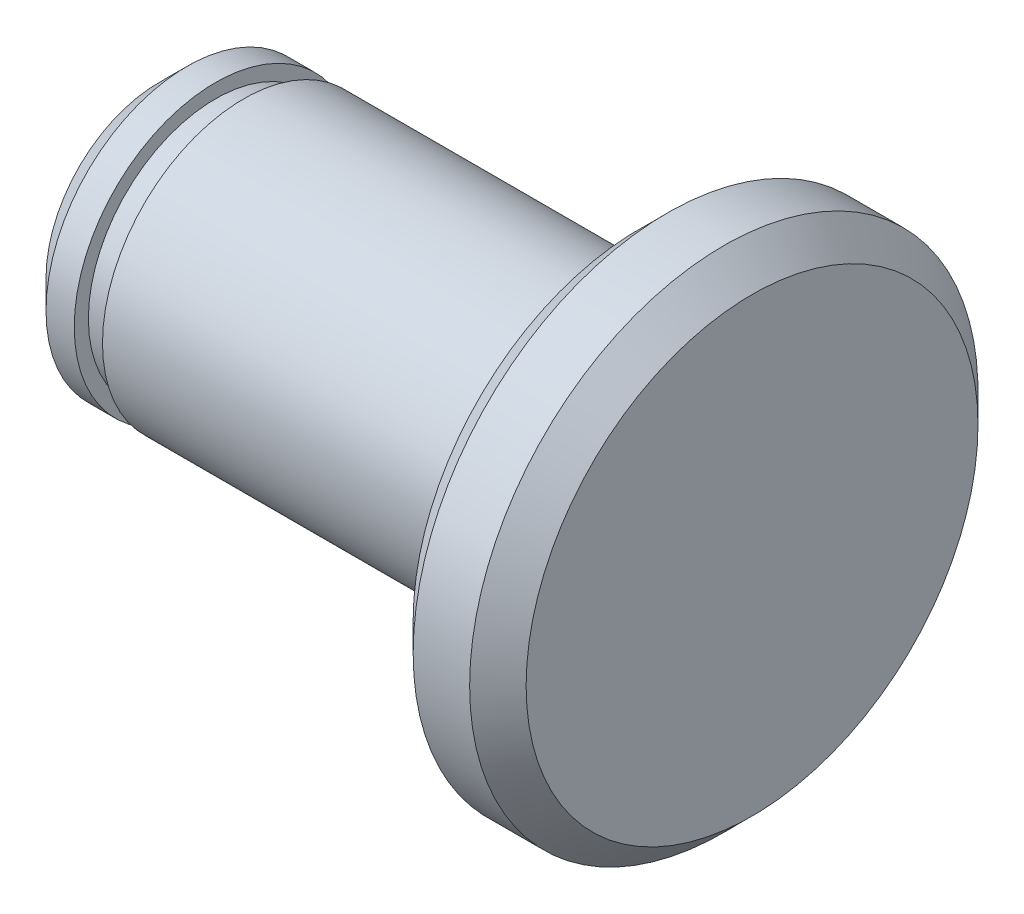
ISO-10303-21;
HEADER;
FILE_DESCRIPTION(('STEP AP214'),'2;1');
FILE_NAME('part.step','',(''),(''),'','','');
FILE_SCHEMA(('AUTOMOTIVE_DESIGN { 1 0 10303 214 1 1 1 1 }'));
ENDSEC;
DATA;
#1=APPLICATION_CONTEXT('core data for automotive mechanical design processes');
#2=APPLICATION_PROTOCOL_DEFINITION('international standard','automotive_design',2000,#1);
#3=PRODUCT_CONTEXT('',#1,'mechanical');
#4=PRODUCT('Part','Part','',(#3));
#5=PRODUCT_RELATED_PRODUCT_CATEGORY('part','',(#4));
#6=PRODUCT_DEFINITION_FORMATION('','',#4);
#7=PRODUCT_DEFINITION_CONTEXT('part definition',#1,'design');
#8=PRODUCT_DEFINITION('design','',#6,#7);
#9=PRODUCT_DEFINITION_SHAPE('','',#8);
#10=(LENGTH_UNIT() NAMED_UNIT(*) SI_UNIT(.MILLI.,.METRE.));
#11=(NAMED_UNIT(*) PLANE_ANGLE_UNIT() SI_UNIT($,.RADIAN.));
#12=(NAMED_UNIT(*) SI_UNIT($,.STERADIAN.) SOLID_ANGLE_UNIT());
#13=UNCERTAINTY_MEASURE_WITH_UNIT(LENGTH_MEASURE(1.E-05),#10,'distance_accuracy_value','');
#14=(GEOMETRIC_REPRESENTATION_CONTEXT(3) GLOBAL_UNCERTAINTY_ASSIGNED_CONTEXT((#13)) GLOBAL_UNIT_ASSIGNED_CONTEXT((#10,
#11,#12)) REPRESENTATION_CONTEXT('',''));
#15=CARTESIAN_POINT('',(0.,0.,0.));
#16=DIRECTION('',(0.,0.,1.));
#17=DIRECTION('',(1.,0.,0.));
#18=AXIS2_PLACEMENT_3D('',#15,#16,#17);
#19=CARTESIAN_POINT('',(-17.,0.,0.));
#20=DIRECTION('',(-1.,0.,0.));
#21=DIRECTION('',(0.,0.,1.));
#22=AXIS2_PLACEMENT_3D('',#19,#20,#21);
#23=PLANE('',#22);
#24=CARTESIAN_POINT('',(-17.,0.,0.));
#25=DIRECTION('',(-1.,0.,0.));
#26=DIRECTION('',(0.,0.,1.));
#27=AXIS2_PLACEMENT_3D('',#24,#25,#26);
#28=CIRCLE('',#27,4.);
#29=CARTESIAN_POINT('',(-17.,0.,4.));
#30=VERTEX_POINT('',#29);
#31=EDGE_CURVE('E10',#30,#30,#28,.T.);
#32=ORIENTED_EDGE('',*,*,#31,.T.);
#33=EDGE_LOOP('',(#32));
#34=FACE_BOUND('',#33,.T.);
#35=ADVANCED_FACE('F39',(#34),#23,.T.);
#36=CARTESIAN_POINT('',(-17.,0.,0.));
#37=DIRECTION('',(1.,0.,0.));
#38=DIRECTION('',(0.,0.,-1.));
#39=AXIS2_PLACEMENT_3D('',#36,#37,#38);
#40=CONICAL_SURFACE('',#39,4.,0.785398163397448);
#41=CARTESIAN_POINT('',(-16.,0.,0.));
#42=DIRECTION('',(-1.,0.,0.));
#43=DIRECTION('',(0.,0.,1.));
#44=AXIS2_PLACEMENT_3D('',#41,#42,#43);
#45=CIRCLE('',#44,5.);
#46=CARTESIAN_POINT('',(-16.,0.,5.));
#47=VERTEX_POINT('',#46);
#48=EDGE_CURVE('E45',#47,#47,#45,.T.);
#49=ORIENTED_EDGE('',*,*,#48,.T.);
#50=EDGE_LOOP('',(#49));
#51=FACE_BOUND('',#50,.T.);
#52=ORIENTED_EDGE('',*,*,#31,.F.);
#53=EDGE_LOOP('',(#52));
#54=FACE_BOUND('',#53,.T.);
#55=ADVANCED_FACE('F92',(#51,#54),#40,.T.);
#56=CARTESIAN_POINT('',(-17.,0.,0.));
#57=DIRECTION('',(-1.,0.,0.));
#58=DIRECTION('',(0.,0.,1.));
#59=AXIS2_PLACEMENT_3D('',#56,#57,#58);
#60=CYLINDRICAL_SURFACE('',#59,5.);
#61=CARTESIAN_POINT('',(-15.,0.,0.));
#62=DIRECTION('',(-1.,0.,0.));
#63=DIRECTION('',(0.,0.,1.));
#64=AXIS2_PLACEMENT_3D('',#61,#62,#63);
#65=CIRCLE('',#64,5.);
#66=CARTESIAN_POINT('',(-15.,0.,5.));
#67=VERTEX_POINT('',#66);
#68=EDGE_CURVE('E49',#67,#67,#65,.T.);
#69=ORIENTED_EDGE('',*,*,#68,.T.);
#70=EDGE_LOOP('',(#69));
#71=FACE_BOUND('',#70,.T.);
#72=ORIENTED_EDGE('',*,*,#48,.F.);
#73=EDGE_LOOP('',(#72));
#74=FACE_BOUND('',#73,.T.);
#75=ADVANCED_FACE('F96',(#71,#74),#60,.T.);
#76=CARTESIAN_POINT('',(-15.,0.,5.));
#77=DIRECTION('',(1.,0.,0.));
#78=DIRECTION('',(0.,0.,-1.));
#79=AXIS2_PLACEMENT_3D('',#76,#77,#78);
#80=PLANE('',#79);
#81=CARTESIAN_POINT('',(-15.,0.,0.));
#82=DIRECTION('',(-1.,0.,0.));
#83=DIRECTION('',(0.,0.,1.));
#84=AXIS2_PLACEMENT_3D('',#81,#82,#83);
#85=CIRCLE('',#84,4.5);
#86=CARTESIAN_POINT('',(-15.,0.,4.5));
#87=VERTEX_POINT('',#86);
#88=EDGE_CURVE('E53',#87,#87,#85,.T.);
#89=ORIENTED_EDGE('',*,*,#88,.T.);
#90=EDGE_LOOP('',(#89));
#91=FACE_BOUND('',#90,.T.);
#92=ORIENTED_EDGE('',*,*,#68,.F.);
#93=EDGE_LOOP('',(#92));
#94=FACE_BOUND('',#93,.T.);
#95=ADVANCED_FACE('F100',(#91,#94),#80,.T.);
#96=CARTESIAN_POINT('',(-17.,0.,0.));
#97=DIRECTION('',(-1.,0.,0.));
#98=DIRECTION('',(0.,0.,1.));
#99=AXIS2_PLACEMENT_3D('',#96,#97,#98);
#100=CYLINDRICAL_SURFACE('',#99,4.5);
#101=CARTESIAN_POINT('',(-14.,0.,0.));
#102=DIRECTION('',(-1.,0.,0.));
#103=DIRECTION('',(0.,0.,1.));
#104=AXIS2_PLACEMENT_3D('',#101,#102,#103);
#105=CIRCLE('',#104,4.5);
#106=CARTESIAN_POINT('',(-14.,0.,4.5));
#107=VERTEX_POINT('',#106);
#108=EDGE_CURVE('E58',#107,#107,#105,.T.);
#109=ORIENTED_EDGE('',*,*,#108,.T.);
#110=EDGE_LOOP('',(#109));
#111=FACE_BOUND('',#110,.T.);
#112=ORIENTED_EDGE('',*,*,#88,.F.);
#113=EDGE_LOOP('',(#112));
#114=FACE_BOUND('',#113,.T.);
#115=ADVANCED_FACE('F107',(#111,#114),#100,.T.);
#116=CARTESIAN_POINT('',(-14.,0.,4.5));
#117=DIRECTION('',(-1.,0.,0.));
#118=DIRECTION('',(0.,0.,1.));
#119=AXIS2_PLACEMENT_3D('',#116,#117,#118);
#120=PLANE('',#119);
#121=CARTESIAN_POINT('',(-14.,0.,0.));
#122=DIRECTION('',(-1.,0.,0.));
#123=DIRECTION('',(0.,0.,1.));
#124=AXIS2_PLACEMENT_3D('',#121,#122,#123);
#125=CIRCLE('',#124,5.);
#126=CARTESIAN_POINT('',(-14.,0.,5.));
#127=VERTEX_POINT('',#126);
#128=EDGE_CURVE('E61',#127,#127,#125,.T.);
#129=ORIENTED_EDGE('',*,*,#128,.T.);
#130=EDGE_LOOP('',(#129));
#131=FACE_BOUND('',#130,.T.);
#132=ORIENTED_EDGE('',*,*,#108,.F.);
#133=EDGE_LOOP('',(#132));
#134=FACE_BOUND('',#133,.T.);
#135=ADVANCED_FACE('F111',(#131,#134),#120,.T.);
#136=CARTESIAN_POINT('',(-17.,0.,0.));
#137=DIRECTION('',(-1.,0.,0.));
#138=DIRECTION('',(0.,0.,1.));
#139=AXIS2_PLACEMENT_3D('',#136,#137,#138);
#140=CYLINDRICAL_SURFACE('',#139,5.);
#141=CARTESIAN_POINT('',(0.,0.,0.));
#142=DIRECTION('',(-1.,0.,0.));
#143=DIRECTION('',(0.,0.,1.));
#144=AXIS2_PLACEMENT_3D('',#141,#142,#143);
#145=CIRCLE('',#144,5.);
#146=CARTESIAN_POINT('',(0.,0.,5.));
#147=VERTEX_POINT('',#146);
#148=EDGE_CURVE('E64',#147,#147,#145,.T.);
#149=ORIENTED_EDGE('',*,*,#148,.T.);
#150=EDGE_LOOP('',(#149));
#151=FACE_BOUND('',#150,.T.);
#152=ORIENTED_EDGE('',*,*,#128,.F.);
#153=EDGE_LOOP('',(#152));
#154=FACE_BOUND('',#153,.T.);
#155=ADVANCED_FACE('F115',(#151,#154),#140,.T.);
#156=CARTESIAN_POINT('',(0.,0.,8.));
#157=DIRECTION('',(-1.,0.,0.));
#158=DIRECTION('',(0.,0.,1.));
#159=AXIS2_PLACEMENT_3D('',#156,#157,#158);
#160=PLANE('',#159);
#161=CARTESIAN_POINT('',(0.,0.,0.));
#162=DIRECTION('',(-1.,0.,0.));
#163=DIRECTION('',(0.,0.,1.));
#164=AXIS2_PLACEMENT_3D('',#161,#162,#163);
#165=CIRCLE('',#164,8.);
#166=CARTESIAN_POINT('',(0.,0.,8.));
#167=VERTEX_POINT('',#166);
#168=EDGE_CURVE('E67',#167,#167,#165,.T.);
#169=ORIENTED_EDGE('',*,*,#168,.T.);
#170=EDGE_LOOP('',(#169));
#171=FACE_BOUND('',#170,.T.);
#172=ORIENTED_EDGE('',*,*,#148,.F.);
#173=EDGE_LOOP('',(#172));
#174=FACE_BOUND('',#173,.T.);
#175=ADVANCED_FACE('F119',(#171,#174),#160,.T.);
#176=CARTESIAN_POINT('',(0.,0.,0.));
#177=DIRECTION('',(1.,0.,0.));
#178=DIRECTION('',(0.,0.,-1.));
#179=AXIS2_PLACEMENT_3D('',#176,#177,#178);
#180=CONICAL_SURFACE('',#179,8.,0.785398163397447);
#181=CARTESIAN_POINT('',(1.,0.,0.));
#182=DIRECTION('',(-1.,0.,0.));
#183=DIRECTION('',(0.,0.,1.));
#184=AXIS2_PLACEMENT_3D('',#181,#182,#183);
#185=CIRCLE('',#184,9.);
#186=CARTESIAN_POINT('',(1.,0.,9.));
#187=VERTEX_POINT('',#186);
#188=EDGE_CURVE('E70',#187,#187,#185,.T.);
#189=ORIENTED_EDGE('',*,*,#188,.T.);
#190=EDGE_LOOP('',(#189));
#191=FACE_BOUND('',#190,.T.);
#192=ORIENTED_EDGE('',*,*,#168,.F.);
#193=EDGE_LOOP('',(#192));
#194=FACE_BOUND('',#193,.T.);
#195=ADVANCED_FACE('F123',(#191,#194),#180,.T.);
#196=CARTESIAN_POINT('',(-17.,0.,0.));
#197=DIRECTION('',(-1.,0.,0.));
#198=DIRECTION('',(0.,0.,1.));
#199=AXIS2_PLACEMENT_3D('',#196,#197,#198);
#200=CYLINDRICAL_SURFACE('',#199,9.);
#201=CARTESIAN_POINT('',(3.,0.,0.));
#202=DIRECTION('',(-1.,0.,0.));
#203=DIRECTION('',(0.,0.,1.));
#204=AXIS2_PLACEMENT_3D('',#201,#202,#203);
#205=CIRCLE('',#204,9.);
#206=CARTESIAN_POINT('',(3.,0.,9.));
#207=VERTEX_POINT('',#206);
#208=EDGE_CURVE('E73',#207,#207,#205,.T.);
#209=ORIENTED_EDGE('',*,*,#208,.T.);
#210=EDGE_LOOP('',(#209));
#211=FACE_BOUND('',#210,.T.);
#212=ORIENTED_EDGE('',*,*,#188,.F.);
#213=EDGE_LOOP('',(#212));
#214=FACE_BOUND('',#213,.T.);
#215=ADVANCED_FACE('F89',(#211,#214),#200,.T.);
#216=CARTESIAN_POINT('',(3.,0.,0.));
#217=DIRECTION('',(-1.,0.,0.));
#218=DIRECTION('',(0.,0.,1.));
#219=AXIS2_PLACEMENT_3D('',#216,#217,#218);
#220=CONICAL_SURFACE('',#219,9.,0.785398163397447);
#221=CARTESIAN_POINT('',(4.,0.,0.));
#222=DIRECTION('',(-1.,0.,0.));
#223=DIRECTION('',(0.,0.,1.));
#224=AXIS2_PLACEMENT_3D('',#221,#222,#223);
#225=CIRCLE('',#224,8.);
#226=CARTESIAN_POINT('',(4.,0.,8.));
#227=VERTEX_POINT('',#226);
#228=EDGE_CURVE('E76',#227,#227,#225,.T.);
#229=ORIENTED_EDGE('',*,*,#228,.T.);
#230=EDGE_LOOP('',(#229));
#231=FACE_BOUND('',#230,.T.);
#232=ORIENTED_EDGE('',*,*,#208,.F.);
#233=EDGE_LOOP('',(#232));
#234=FACE_BOUND('',#233,.T.);
#235=ADVANCED_FACE('F80',(#231,#234),#220,.T.);
#236=CARTESIAN_POINT('',(4.,0.,8.));
#237=DIRECTION('',(1.,0.,0.));
#238=DIRECTION('',(0.,0.,-1.));
#239=AXIS2_PLACEMENT_3D('',#236,#237,#238);
#240=PLANE('',#239);
#241=ORIENTED_EDGE('',*,*,#228,.F.);
#242=EDGE_LOOP('',(#241));
#243=FACE_BOUND('',#242,.T.);
#244=ADVANCED_FACE('F83',(#243),#240,.T.);
#245=CLOSED_SHELL('',(#35,#55,#75,#95,#115,#135,#155,#175,#195,#215,#235,#244));
#246=MANIFOLD_SOLID_BREP('B2',#245);
#247=ADVANCED_BREP_SHAPE_REPRESENTATION('',(#18,#246),#14);
#248=SHAPE_DEFINITION_REPRESENTATION(#9,#247);
ENDSEC;
END-ISO-10303-21;
